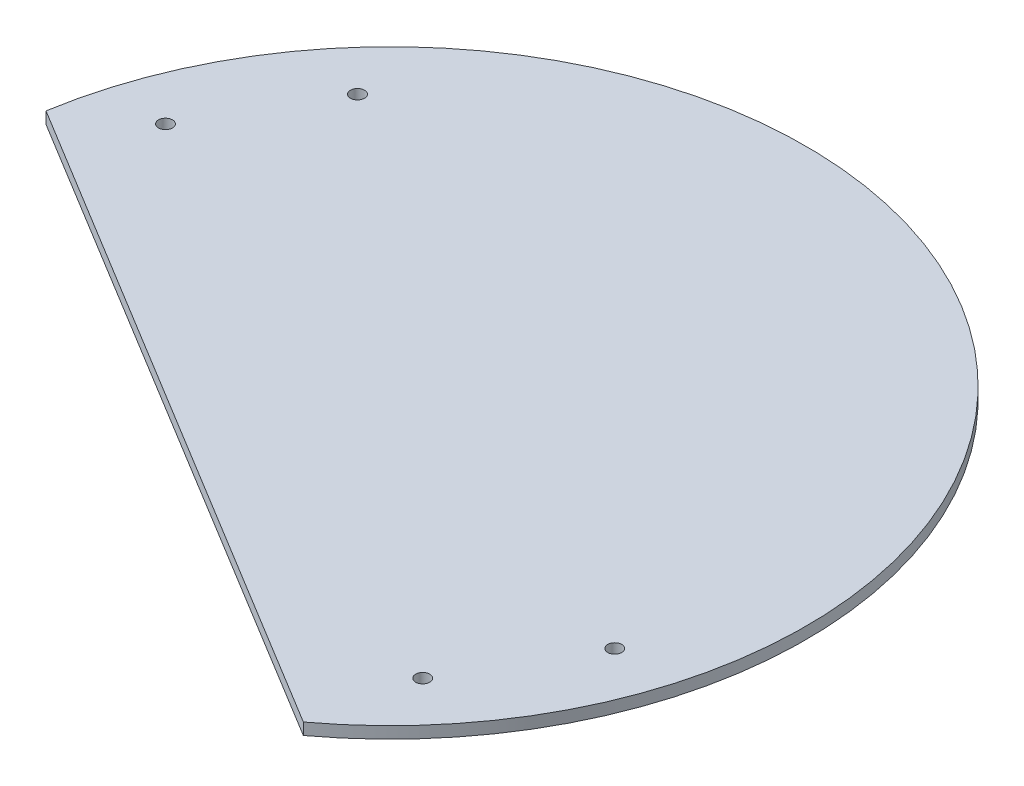
ISO-10303-21;
HEADER;
FILE_DESCRIPTION(('STEP AP214'),'2;1');
FILE_NAME('part.step','',(''),(''),'','','');
FILE_SCHEMA(('AUTOMOTIVE_DESIGN { 1 0 10303 214 1 1 1 1 }'));
ENDSEC;
DATA;
#1=APPLICATION_CONTEXT('core data for automotive mechanical design processes');
#2=APPLICATION_PROTOCOL_DEFINITION('international standard','automotive_design',2000,#1);
#3=PRODUCT_CONTEXT('',#1,'mechanical');
#4=PRODUCT('Part','Part','',(#3));
#5=PRODUCT_RELATED_PRODUCT_CATEGORY('part','',(#4));
#6=PRODUCT_DEFINITION_FORMATION('','',#4);
#7=PRODUCT_DEFINITION_CONTEXT('part definition',#1,'design');
#8=PRODUCT_DEFINITION('design','',#6,#7);
#9=PRODUCT_DEFINITION_SHAPE('','',#8);
#10=(LENGTH_UNIT() NAMED_UNIT(*) SI_UNIT(.MILLI.,.METRE.));
#11=(NAMED_UNIT(*) PLANE_ANGLE_UNIT() SI_UNIT($,.RADIAN.));
#12=(NAMED_UNIT(*) SI_UNIT($,.STERADIAN.) SOLID_ANGLE_UNIT());
#13=UNCERTAINTY_MEASURE_WITH_UNIT(LENGTH_MEASURE(1.E-05),#10,'distance_accuracy_value','');
#14=(GEOMETRIC_REPRESENTATION_CONTEXT(3) GLOBAL_UNCERTAINTY_ASSIGNED_CONTEXT((#13)) GLOBAL_UNIT_ASSIGNED_CONTEXT((#10,
#11,#12)) REPRESENTATION_CONTEXT('',''));
#15=CARTESIAN_POINT('',(0.,0.,0.));
#16=DIRECTION('',(0.,0.,1.));
#17=DIRECTION('',(1.,0.,0.));
#18=AXIS2_PLACEMENT_3D('',#15,#16,#17);
#19=CARTESIAN_POINT('',(135.338999709347,5.,117.383106000489));
#20=DIRECTION('',(0.,1.,0.));
#21=DIRECTION('',(0.,0.,1.));
#22=AXIS2_PLACEMENT_3D('',#19,#20,#21);
#23=PLANE('',#22);
#24=CARTESIAN_POINT('',(250.242810277012,5.,218.363868114023));
#25=DIRECTION('',(0.,1.,0.));
#26=DIRECTION('',(0.,0.,1.));
#27=AXIS2_PLACEMENT_3D('',#24,#25,#26);
#28=CIRCLE('',#27,2.99999999999999);
#29=CARTESIAN_POINT('',(250.242810277012,5.,221.363868114023));
#30=VERTEX_POINT('',#29);
#31=EDGE_CURVE('E90',#30,#30,#28,.T.);
#32=ORIENTED_EDGE('',*,*,#31,.F.);
#33=EDGE_LOOP('',(#32));
#34=FACE_BOUND('',#33,.T.);
#35=CARTESIAN_POINT('',(20.4351891416824,5.,16.4023438869544));
#36=DIRECTION('',(0.,1.,0.));
#37=DIRECTION('',(0.,0.,1.));
#38=AXIS2_PLACEMENT_3D('',#35,#36,#37);
#39=CIRCLE('',#38,3.);
#40=CARTESIAN_POINT('',(20.4351891416824,5.,19.4023438869544));
#41=VERTEX_POINT('',#40);
#42=EDGE_CURVE('E76',#41,#41,#39,.T.);
#43=ORIENTED_EDGE('',*,*,#42,.F.);
#44=EDGE_LOOP('',(#43));
#45=FACE_BOUND('',#44,.T.);
#46=CARTESIAN_POINT('',(135.338999709347,5.,117.383106000489));
#47=DIRECTION('',(0.,1.,0.));
#48=DIRECTION('',(0.,0.,1.));
#49=AXIS2_PLACEMENT_3D('',#46,#47,#48);
#50=CIRCLE('',#49,177.5);
#51=CARTESIAN_POINT('',(240.960836827374,5.,260.037504894505));
#52=VERTEX_POINT('',#51);
#53=CARTESIAN_POINT('',(-39.8853794816076,5.,89.0517287458539));
#54=VERTEX_POINT('',#53);
#55=EDGE_CURVE('E70',#52,#54,#50,.T.);
#56=ORIENTED_EDGE('',*,*,#55,.T.);
#57=DIRECTION('',(0.854150051796851,0.,0.520026623371762));
#58=VECTOR('',#57,1.);
#59=CARTESIAN_POINT('',(-39.8853794816076,5.,89.0517287458539));
#60=LINE('',#59,#58);
#61=EDGE_CURVE('E55',#54,#52,#60,.T.);
#62=ORIENTED_EDGE('',*,*,#61,.T.);
#63=EDGE_LOOP('',(#56,#62));
#64=FACE_BOUND('',#63,.T.);
#65=CARTESIAN_POINT('',(-9.56481085831853,5.,68.3638681140218));
#66=DIRECTION('',(0.,1.,0.));
#67=DIRECTION('',(0.,0.,1.));
#68=AXIS2_PLACEMENT_3D('',#65,#66,#67);
#69=CIRCLE('',#68,3.);
#70=CARTESIAN_POINT('',(-9.56481085831853,5.,71.3638681140218));
#71=VERTEX_POINT('',#70);
#72=EDGE_CURVE('E85',#71,#71,#69,.T.);
#73=ORIENTED_EDGE('',*,*,#72,.F.);
#74=EDGE_LOOP('',(#73));
#75=FACE_BOUND('',#74,.T.);
#76=CARTESIAN_POINT('',(280.242810277013,5.,166.402343886955));
#77=DIRECTION('',(0.,1.,0.));
#78=DIRECTION('',(0.,0.,1.));
#79=AXIS2_PLACEMENT_3D('',#76,#77,#78);
#80=CIRCLE('',#79,2.99999999999999);
#81=CARTESIAN_POINT('',(280.242810277013,5.,169.402343886955));
#82=VERTEX_POINT('',#81);
#83=EDGE_CURVE('E96',#82,#82,#80,.T.);
#84=ORIENTED_EDGE('',*,*,#83,.F.);
#85=EDGE_LOOP('',(#84));
#86=FACE_BOUND('',#85,.T.);
#87=ADVANCED_FACE('F39',(#34,#45,#64,#75,#86),#23,.T.);
#88=CARTESIAN_POINT('',(135.338999709347,0.,117.383106000489));
#89=DIRECTION('',(0.,1.,0.));
#90=DIRECTION('',(0.,0.,1.));
#91=AXIS2_PLACEMENT_3D('',#88,#89,#90);
#92=PLANE('',#91);
#93=CARTESIAN_POINT('',(135.338999709347,0.,117.383106000489));
#94=DIRECTION('',(0.,1.,0.));
#95=DIRECTION('',(0.,0.,1.));
#96=AXIS2_PLACEMENT_3D('',#93,#94,#95);
#97=CIRCLE('',#96,177.5);
#98=CARTESIAN_POINT('',(240.960836827374,0.,260.037504894505));
#99=VERTEX_POINT('',#98);
#100=CARTESIAN_POINT('',(-39.8853794816076,0.,89.0517287458539));
#101=VERTEX_POINT('',#100);
#102=EDGE_CURVE('E71',#99,#101,#97,.T.);
#103=ORIENTED_EDGE('',*,*,#102,.F.);
#104=DIRECTION('',(0.854150051796851,0.,0.520026623371762));
#105=VECTOR('',#104,1.);
#106=CARTESIAN_POINT('',(-39.8853794816076,0.,89.0517287458539));
#107=LINE('',#106,#105);
#108=EDGE_CURVE('E63',#101,#99,#107,.T.);
#109=ORIENTED_EDGE('',*,*,#108,.F.);
#110=EDGE_LOOP('',(#103,#109));
#111=FACE_BOUND('',#110,.T.);
#112=CARTESIAN_POINT('',(20.4351891416824,0.,16.4023438869544));
#113=DIRECTION('',(0.,1.,0.));
#114=DIRECTION('',(0.,0.,1.));
#115=AXIS2_PLACEMENT_3D('',#112,#113,#114);
#116=CIRCLE('',#115,3.);
#117=CARTESIAN_POINT('',(20.4351891416824,0.,19.4023438869544));
#118=VERTEX_POINT('',#117);
#119=EDGE_CURVE('E79',#118,#118,#116,.T.);
#120=ORIENTED_EDGE('',*,*,#119,.T.);
#121=EDGE_LOOP('',(#120));
#122=FACE_BOUND('',#121,.T.);
#123=CARTESIAN_POINT('',(-9.56481085831853,0.,68.3638681140218));
#124=DIRECTION('',(0.,1.,0.));
#125=DIRECTION('',(0.,0.,1.));
#126=AXIS2_PLACEMENT_3D('',#123,#124,#125);
#127=CIRCLE('',#126,3.);
#128=CARTESIAN_POINT('',(-9.56481085831853,0.,71.3638681140218));
#129=VERTEX_POINT('',#128);
#130=EDGE_CURVE('E87',#129,#129,#127,.T.);
#131=ORIENTED_EDGE('',*,*,#130,.T.);
#132=EDGE_LOOP('',(#131));
#133=FACE_BOUND('',#132,.T.);
#134=CARTESIAN_POINT('',(250.242810277012,0.,218.363868114023));
#135=DIRECTION('',(0.,1.,0.));
#136=DIRECTION('',(0.,0.,1.));
#137=AXIS2_PLACEMENT_3D('',#134,#135,#136);
#138=CIRCLE('',#137,2.99999999999999);
#139=CARTESIAN_POINT('',(250.242810277012,0.,221.363868114023));
#140=VERTEX_POINT('',#139);
#141=EDGE_CURVE('E93',#140,#140,#138,.T.);
#142=ORIENTED_EDGE('',*,*,#141,.T.);
#143=EDGE_LOOP('',(#142));
#144=FACE_BOUND('',#143,.T.);
#145=CARTESIAN_POINT('',(280.242810277013,0.,166.402343886955));
#146=DIRECTION('',(0.,1.,0.));
#147=DIRECTION('',(0.,0.,1.));
#148=AXIS2_PLACEMENT_3D('',#145,#146,#147);
#149=CIRCLE('',#148,2.99999999999999);
#150=CARTESIAN_POINT('',(280.242810277013,0.,169.402343886955));
#151=VERTEX_POINT('',#150);
#152=EDGE_CURVE('E99',#151,#151,#149,.T.);
#153=ORIENTED_EDGE('',*,*,#152,.T.);
#154=EDGE_LOOP('',(#153));
#155=FACE_BOUND('',#154,.T.);
#156=ADVANCED_FACE('F74',(#111,#122,#133,#144,#155),#92,.F.);
#157=CARTESIAN_POINT('',(135.338999709347,5.,117.383106000489));
#158=DIRECTION('',(0.,-1.,0.));
#159=DIRECTION('',(0.,0.,-1.));
#160=AXIS2_PLACEMENT_3D('',#157,#158,#159);
#161=CYLINDRICAL_SURFACE('',#160,177.5);
#162=ORIENTED_EDGE('',*,*,#102,.T.);
#163=DIRECTION('',(0.,-1.,0.));
#164=VECTOR('',#163,1.);
#165=CARTESIAN_POINT('',(-39.8853794816076,5.,89.0517287458539));
#166=LINE('',#165,#164);
#167=EDGE_CURVE('E11',#54,#101,#166,.T.);
#168=ORIENTED_EDGE('',*,*,#167,.F.);
#169=ORIENTED_EDGE('',*,*,#55,.F.);
#170=DIRECTION('',(0.,-1.,0.));
#171=VECTOR('',#170,1.);
#172=CARTESIAN_POINT('',(240.960836827374,5.,260.037504894505));
#173=LINE('',#172,#171);
#174=EDGE_CURVE('E48',#52,#99,#173,.T.);
#175=ORIENTED_EDGE('',*,*,#174,.T.);
#176=EDGE_LOOP('',(#162,#168,#169,#175));
#177=FACE_BOUND('',#176,.T.);
#178=ADVANCED_FACE('F41',(#177),#161,.T.);
#179=CARTESIAN_POINT('',(-39.8853794816076,5.,89.0517287458539));
#180=DIRECTION('',(0.520026623371762,0.,-0.854150051796851));
#181=DIRECTION('',(-0.854150051796851,0.,-0.520026623371762));
#182=AXIS2_PLACEMENT_3D('',#179,#180,#181);
#183=PLANE('',#182);
#184=ORIENTED_EDGE('',*,*,#108,.T.);
#185=ORIENTED_EDGE('',*,*,#174,.F.);
#186=ORIENTED_EDGE('',*,*,#61,.F.);
#187=ORIENTED_EDGE('',*,*,#167,.T.);
#188=EDGE_LOOP('',(#184,#185,#186,#187));
#189=FACE_BOUND('',#188,.T.);
#190=ADVANCED_FACE('F66',(#189),#183,.F.);
#191=CARTESIAN_POINT('',(20.4351891416824,5.,16.4023438869544));
#192=DIRECTION('',(0.,-1.,0.));
#193=DIRECTION('',(0.,0.,-1.));
#194=AXIS2_PLACEMENT_3D('',#191,#192,#193);
#195=CYLINDRICAL_SURFACE('',#194,3.);
#196=ORIENTED_EDGE('',*,*,#42,.T.);
#197=EDGE_LOOP('',(#196));
#198=FACE_BOUND('',#197,.T.);
#199=ORIENTED_EDGE('',*,*,#119,.F.);
#200=EDGE_LOOP('',(#199));
#201=FACE_BOUND('',#200,.T.);
#202=ADVANCED_FACE('F118',(#198,#201),#195,.F.);
#203=CARTESIAN_POINT('',(-9.56481085831853,5.,68.3638681140218));
#204=DIRECTION('',(0.,-1.,0.));
#205=DIRECTION('',(0.,0.,-1.));
#206=AXIS2_PLACEMENT_3D('',#203,#204,#205);
#207=CYLINDRICAL_SURFACE('',#206,3.);
#208=ORIENTED_EDGE('',*,*,#72,.T.);
#209=EDGE_LOOP('',(#208));
#210=FACE_BOUND('',#209,.T.);
#211=ORIENTED_EDGE('',*,*,#130,.F.);
#212=EDGE_LOOP('',(#211));
#213=FACE_BOUND('',#212,.T.);
#214=ADVANCED_FACE('F125',(#210,#213),#207,.F.);
#215=CARTESIAN_POINT('',(250.242810277012,5.,218.363868114023));
#216=DIRECTION('',(0.,-1.,0.));
#217=DIRECTION('',(0.,0.,-1.));
#218=AXIS2_PLACEMENT_3D('',#215,#216,#217);
#219=CYLINDRICAL_SURFACE('',#218,2.99999999999999);
#220=ORIENTED_EDGE('',*,*,#31,.T.);
#221=EDGE_LOOP('',(#220));
#222=FACE_BOUND('',#221,.T.);
#223=ORIENTED_EDGE('',*,*,#141,.F.);
#224=EDGE_LOOP('',(#223));
#225=FACE_BOUND('',#224,.T.);
#226=ADVANCED_FACE('F165',(#222,#225),#219,.F.);
#227=CARTESIAN_POINT('',(280.242810277013,5.,166.402343886955));
#228=DIRECTION('',(0.,-1.,0.));
#229=DIRECTION('',(0.,0.,-1.));
#230=AXIS2_PLACEMENT_3D('',#227,#228,#229);
#231=CYLINDRICAL_SURFACE('',#230,2.99999999999999);
#232=ORIENTED_EDGE('',*,*,#83,.T.);
#233=EDGE_LOOP('',(#232));
#234=FACE_BOUND('',#233,.T.);
#235=ORIENTED_EDGE('',*,*,#152,.F.);
#236=EDGE_LOOP('',(#235));
#237=FACE_BOUND('',#236,.T.);
#238=ADVANCED_FACE('F105',(#234,#237),#231,.F.);
#239=CLOSED_SHELL('',(#87,#156,#178,#190,#202,#214,#226,#238));
#240=MANIFOLD_SOLID_BREP('B2',#239);
#241=ADVANCED_BREP_SHAPE_REPRESENTATION('',(#18,#240),#14);
#242=SHAPE_DEFINITION_REPRESENTATION(#9,#241);
ENDSEC;
END-ISO-10303-21;
